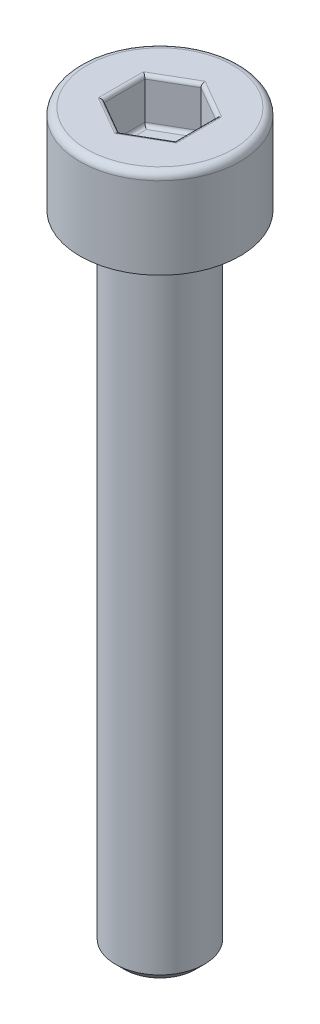
ISO-10303-21;
HEADER;
FILE_DESCRIPTION(('STEP AP214'),'2;1');
FILE_NAME('part.step','',(''),(''),'','','');
FILE_SCHEMA(('AUTOMOTIVE_DESIGN { 1 0 10303 214 1 1 1 1 }'));
ENDSEC;
DATA;
#1=APPLICATION_CONTEXT('core data for automotive mechanical design processes');
#2=APPLICATION_PROTOCOL_DEFINITION('international standard','automotive_design',2000,#1);
#3=PRODUCT_CONTEXT('',#1,'mechanical');
#4=PRODUCT('Part','Part','',(#3));
#5=PRODUCT_RELATED_PRODUCT_CATEGORY('part','',(#4));
#6=PRODUCT_DEFINITION_FORMATION('','',#4);
#7=PRODUCT_DEFINITION_CONTEXT('part definition',#1,'design');
#8=PRODUCT_DEFINITION('design','',#6,#7);
#9=PRODUCT_DEFINITION_SHAPE('','',#8);
#10=(LENGTH_UNIT() NAMED_UNIT(*) SI_UNIT(.MILLI.,.METRE.));
#11=(NAMED_UNIT(*) PLANE_ANGLE_UNIT() SI_UNIT($,.RADIAN.));
#12=(NAMED_UNIT(*) SI_UNIT($,.STERADIAN.) SOLID_ANGLE_UNIT());
#13=UNCERTAINTY_MEASURE_WITH_UNIT(LENGTH_MEASURE(1.E-05),#10,'distance_accuracy_value','');
#14=(GEOMETRIC_REPRESENTATION_CONTEXT(3) GLOBAL_UNCERTAINTY_ASSIGNED_CONTEXT((#13)) GLOBAL_UNIT_ASSIGNED_CONTEXT((#10,
#11,#12)) REPRESENTATION_CONTEXT('',''));
#15=CARTESIAN_POINT('',(0.,0.,0.));
#16=DIRECTION('',(0.,0.,1.));
#17=DIRECTION('',(1.,0.,0.));
#18=AXIS2_PLACEMENT_3D('',#15,#16,#17);
#19=CARTESIAN_POINT('',(0.,-20.5,0.));
#20=DIRECTION('',(0.,-1.,0.));
#21=DIRECTION('',(0.,0.,-1.));
#22=AXIS2_PLACEMENT_3D('',#19,#20,#21);
#23=PLANE('',#22);
#24=CARTESIAN_POINT('',(0.,-20.5,0.));
#25=DIRECTION('',(0.,-1.,0.));
#26=DIRECTION('',(0.,0.,-1.));
#27=AXIS2_PLACEMENT_3D('',#24,#25,#26);
#28=CIRCLE('',#27,0.999999999999997);
#29=CARTESIAN_POINT('',(0.,-20.5,-0.999999999999997));
#30=VERTEX_POINT('',#29);
#31=EDGE_CURVE('E265',#30,#30,#28,.T.);
#32=ORIENTED_EDGE('',*,*,#31,.T.);
#33=EDGE_LOOP('',(#32));
#34=FACE_BOUND('',#33,.T.);
#35=ADVANCED_FACE('F37',(#34),#23,.T.);
#36=CARTESIAN_POINT('',(0.,0.,0.));
#37=DIRECTION('',(0.,1.,0.));
#38=DIRECTION('',(0.,0.,1.));
#39=AXIS2_PLACEMENT_3D('',#36,#37,#38);
#40=CYLINDRICAL_SURFACE('',#39,1.25);
#41=CARTESIAN_POINT('',(0.,-2.74999999999999,0.));
#42=DIRECTION('',(0.,-1.,0.));
#43=DIRECTION('',(0.,0.,-1.));
#44=AXIS2_PLACEMENT_3D('',#41,#42,#43);
#45=CIRCLE('',#44,1.25);
#46=CARTESIAN_POINT('',(0.,-2.74999999999999,-1.25));
#47=VERTEX_POINT('',#46);
#48=EDGE_CURVE('E262',#47,#47,#45,.T.);
#49=ORIENTED_EDGE('',*,*,#48,.T.);
#50=EDGE_LOOP('',(#49));
#51=FACE_BOUND('',#50,.T.);
#52=CARTESIAN_POINT('',(0.,-20.25,0.));
#53=DIRECTION('',(0.,-1.,0.));
#54=DIRECTION('',(0.,0.,-1.));
#55=AXIS2_PLACEMENT_3D('',#52,#53,#54);
#56=CIRCLE('',#55,1.25);
#57=CARTESIAN_POINT('',(0.,-20.25,-1.25));
#58=VERTEX_POINT('',#57);
#59=EDGE_CURVE('E259',#58,#58,#56,.F.);
#60=ORIENTED_EDGE('',*,*,#59,.T.);
#61=EDGE_LOOP('',(#60));
#62=FACE_BOUND('',#61,.T.);
#63=ADVANCED_FACE('F291',(#51,#62),#40,.T.);
#64=CARTESIAN_POINT('',(-1.25,-2.5,0.));
#65=DIRECTION('',(0.,-1.,0.));
#66=DIRECTION('',(0.,0.,-1.));
#67=AXIS2_PLACEMENT_3D('',#64,#65,#66);
#68=PLANE('',#67);
#69=CARTESIAN_POINT('',(0.,-2.5,0.));
#70=DIRECTION('',(0.,-1.,0.));
#71=DIRECTION('',(0.,0.,-1.));
#72=AXIS2_PLACEMENT_3D('',#69,#70,#71);
#73=CIRCLE('',#72,1.5);
#74=CARTESIAN_POINT('',(0.,-2.5,-1.5));
#75=VERTEX_POINT('',#74);
#76=EDGE_CURVE('E256',#75,#75,#73,.F.);
#77=ORIENTED_EDGE('',*,*,#76,.T.);
#78=EDGE_LOOP('',(#77));
#79=FACE_BOUND('',#78,.T.);
#80=CARTESIAN_POINT('',(0.,-2.5,0.));
#81=DIRECTION('',(0.,1.,0.));
#82=DIRECTION('',(0.,0.,1.));
#83=AXIS2_PLACEMENT_3D('',#80,#81,#82);
#84=CIRCLE('',#83,2.25);
#85=CARTESIAN_POINT('',(0.,-2.5,2.25));
#86=VERTEX_POINT('',#85);
#87=EDGE_CURVE('E253',#86,#86,#84,.T.);
#88=ORIENTED_EDGE('',*,*,#87,.F.);
#89=EDGE_LOOP('',(#88));
#90=FACE_BOUND('',#89,.T.);
#91=ADVANCED_FACE('F297',(#79,#90),#68,.T.);
#92=CARTESIAN_POINT('',(0.,0.,0.));
#93=DIRECTION('',(0.,1.,0.));
#94=DIRECTION('',(0.,0.,1.));
#95=AXIS2_PLACEMENT_3D('',#92,#93,#94);
#96=CYLINDRICAL_SURFACE('',#95,2.25);
#97=CARTESIAN_POINT('',(0.,-0.2,0.));
#98=DIRECTION('',(0.,1.,0.));
#99=DIRECTION('',(0.,0.,1.));
#100=AXIS2_PLACEMENT_3D('',#97,#98,#99);
#101=CIRCLE('',#100,2.25);
#102=CARTESIAN_POINT('',(0.,-0.2,2.25));
#103=VERTEX_POINT('',#102);
#104=EDGE_CURVE('E163',#103,#103,#101,.F.);
#105=ORIENTED_EDGE('',*,*,#104,.T.);
#106=EDGE_LOOP('',(#105));
#107=FACE_BOUND('',#106,.T.);
#108=ORIENTED_EDGE('',*,*,#87,.T.);
#109=EDGE_LOOP('',(#108));
#110=FACE_BOUND('',#109,.T.);
#111=ADVANCED_FACE('F307',(#107,#110),#96,.T.);
#112=CARTESIAN_POINT('',(-2.25,0.,0.));
#113=DIRECTION('',(0.,1.,0.));
#114=DIRECTION('',(0.,0.,1.));
#115=AXIS2_PLACEMENT_3D('',#112,#113,#114);
#116=PLANE('',#115);
#117=DIRECTION('',(0.,0.,1.));
#118=VECTOR('',#117,1.);
#119=CARTESIAN_POINT('',(-1.1,0.,-0.577350269189627));
#120=LINE('',#119,#118);
#121=CARTESIAN_POINT('',(-1.1,0.,0.635085296108588));
#122=VERTEX_POINT('',#121);
#123=CARTESIAN_POINT('',(-1.1,0.,-0.635085296108589));
#124=VERTEX_POINT('',#123);
#125=EDGE_CURVE('E179',#122,#124,#120,.F.);
#126=ORIENTED_EDGE('',*,*,#125,.T.);
#127=DIRECTION('',(-0.866025403784439,0.,0.5));
#128=VECTOR('',#127,1.);
#129=CARTESIAN_POINT('',(-0.0500000000000009,0.,-1.2413030787577));
#130=LINE('',#129,#128);
#131=CARTESIAN_POINT('',(0.,0.,-1.27017059221718));
#132=VERTEX_POINT('',#131);
#133=EDGE_CURVE('E138',#124,#132,#130,.F.);
#134=ORIENTED_EDGE('',*,*,#133,.T.);
#135=DIRECTION('',(-0.866025403784439,0.,-0.5));
#136=VECTOR('',#135,1.);
#137=CARTESIAN_POINT('',(1.05,0.,-0.663952809568071));
#138=LINE('',#137,#136);
#139=CARTESIAN_POINT('',(1.1,0.,-0.63508529610859));
#140=VERTEX_POINT('',#139);
#141=EDGE_CURVE('E165',#132,#140,#138,.F.);
#142=ORIENTED_EDGE('',*,*,#141,.T.);
#143=DIRECTION('',(0.,0.,-1.));
#144=VECTOR('',#143,1.);
#145=CARTESIAN_POINT('',(1.1,0.,0.577350269189625));
#146=LINE('',#145,#144);
#147=CARTESIAN_POINT('',(1.1,0.,0.635085296108588));
#148=VERTEX_POINT('',#147);
#149=EDGE_CURVE('E173',#140,#148,#146,.F.);
#150=ORIENTED_EDGE('',*,*,#149,.T.);
#151=DIRECTION('',(0.866025403784439,0.,-0.5));
#152=VECTOR('',#151,1.);
#153=CARTESIAN_POINT('',(0.0499999999999991,0.,1.24130307875769));
#154=LINE('',#153,#152);
#155=CARTESIAN_POINT('',(0.,0.,1.27017059221718));
#156=VERTEX_POINT('',#155);
#157=EDGE_CURVE('E175',#148,#156,#154,.F.);
#158=ORIENTED_EDGE('',*,*,#157,.T.);
#159=DIRECTION('',(0.866025403784439,0.,0.5));
#160=VECTOR('',#159,1.);
#161=CARTESIAN_POINT('',(-1.05,0.,0.663952809568069));
#162=LINE('',#161,#160);
#163=EDGE_CURVE('E177',#156,#122,#162,.F.);
#164=ORIENTED_EDGE('',*,*,#163,.T.);
#165=EDGE_LOOP('',(#126,#134,#142,#150,#158,#164));
#166=FACE_BOUND('',#165,.T.);
#167=CARTESIAN_POINT('',(0.,0.,0.));
#168=DIRECTION('',(0.,1.,0.));
#169=DIRECTION('',(0.,0.,1.));
#170=AXIS2_PLACEMENT_3D('',#167,#168,#169);
#171=CIRCLE('',#170,2.05);
#172=CARTESIAN_POINT('',(0.,0.,2.05));
#173=VERTEX_POINT('',#172);
#174=EDGE_CURVE('E168',#173,#173,#171,.T.);
#175=ORIENTED_EDGE('',*,*,#174,.T.);
#176=EDGE_LOOP('',(#175));
#177=FACE_BOUND('',#176,.T.);
#178=ADVANCED_FACE('F270',(#166,#177),#116,.T.);
#179=CARTESIAN_POINT('',(0.,-2.5,0.));
#180=DIRECTION('',(0.,1.,0.));
#181=DIRECTION('',(0.,0.,1.));
#182=AXIS2_PLACEMENT_3D('',#179,#180,#181);
#183=CONICAL_SURFACE('',#182,1.5,0.785398163397457);
#184=ORIENTED_EDGE('',*,*,#48,.F.);
#185=EDGE_LOOP('',(#184));
#186=FACE_BOUND('',#185,.T.);
#187=ORIENTED_EDGE('',*,*,#76,.F.);
#188=EDGE_LOOP('',(#187));
#189=FACE_BOUND('',#188,.T.);
#190=ADVANCED_FACE('F285',(#186,#189),#183,.T.);
#191=CARTESIAN_POINT('',(0.,-20.25,0.));
#192=DIRECTION('',(0.,1.,0.));
#193=DIRECTION('',(0.,0.,1.));
#194=AXIS2_PLACEMENT_3D('',#191,#192,#193);
#195=CONICAL_SURFACE('',#194,1.25,0.785398163397447);
#196=ORIENTED_EDGE('',*,*,#31,.F.);
#197=EDGE_LOOP('',(#196));
#198=FACE_BOUND('',#197,.T.);
#199=ORIENTED_EDGE('',*,*,#59,.F.);
#200=EDGE_LOOP('',(#199));
#201=FACE_BOUND('',#200,.T.);
#202=ADVANCED_FACE('F275',(#198,#201),#195,.T.);
#203=CARTESIAN_POINT('',(0.,-0.2,0.));
#204=DIRECTION('',(0.,1.,0.));
#205=DIRECTION('',(0.,0.,1.));
#206=AXIS2_PLACEMENT_3D('',#203,#204,#205);
#207=TOROIDAL_SURFACE('',#206,2.05,0.2);
#208=ORIENTED_EDGE('',*,*,#104,.F.);
#209=EDGE_LOOP('',(#208));
#210=FACE_BOUND('',#209,.T.);
#211=ORIENTED_EDGE('',*,*,#174,.F.);
#212=EDGE_LOOP('',(#211));
#213=FACE_BOUND('',#212,.T.);
#214=ADVANCED_FACE('F272',(#210,#213),#207,.T.);
#215=CARTESIAN_POINT('',(0.999999999999998,-1.25,-0.577350269189627));
#216=DIRECTION('',(0.5,0.,-0.866025403784439));
#217=DIRECTION('',(-0.866025403784439,0.,-0.5));
#218=AXIS2_PLACEMENT_3D('',#215,#216,#217);
#219=PLANE('',#218);
#220=DIRECTION('',(0.,1.,0.));
#221=VECTOR('',#220,1.);
#222=CARTESIAN_POINT('',(0.999999999999998,-1.25,-0.577350269189627));
#223=LINE('',#222,#221);
#224=CARTESIAN_POINT('',(0.999999999999998,-1.15,-0.577350269189627));
#225=VERTEX_POINT('',#224);
#226=CARTESIAN_POINT('',(0.999999999999998,-0.1,-0.577350269189627));
#227=VERTEX_POINT('',#226);
#228=EDGE_CURVE('E247',#225,#227,#223,.T.);
#229=ORIENTED_EDGE('',*,*,#228,.T.);
#230=DIRECTION('',(-0.866025403784439,0.,-0.5));
#231=VECTOR('',#230,1.);
#232=CARTESIAN_POINT('',(0.,-0.1,-1.15470053837925));
#233=LINE('',#232,#231);
#234=CARTESIAN_POINT('',(0.,-0.1,-1.15470053837925));
#235=VERTEX_POINT('',#234);
#236=EDGE_CURVE('E199',#227,#235,#233,.T.);
#237=ORIENTED_EDGE('',*,*,#236,.T.);
#238=DIRECTION('',(0.,1.,0.));
#239=VECTOR('',#238,1.);
#240=CARTESIAN_POINT('',(0.,-1.25,-1.15470053837925));
#241=LINE('',#240,#239);
#242=CARTESIAN_POINT('',(0.,-1.15,-1.15470053837925));
#243=VERTEX_POINT('',#242);
#244=EDGE_CURVE('E149',#243,#235,#241,.T.);
#245=ORIENTED_EDGE('',*,*,#244,.F.);
#246=DIRECTION('',(-0.866025403784439,0.,-0.5));
#247=VECTOR('',#246,1.);
#248=CARTESIAN_POINT('',(0.999999999999998,-1.15,-0.577350269189627));
#249=LINE('',#248,#247);
#250=EDGE_CURVE('E197',#243,#225,#249,.F.);
#251=ORIENTED_EDGE('',*,*,#250,.T.);
#252=EDGE_LOOP('',(#229,#237,#245,#251));
#253=FACE_BOUND('',#252,.T.);
#254=ADVANCED_FACE('F274',(#253),#219,.F.);
#255=CARTESIAN_POINT('',(0.999999999999999,-1.25,0.577350269189625));
#256=DIRECTION('',(1.,0.,0.));
#257=DIRECTION('',(0.,0.,-1.));
#258=AXIS2_PLACEMENT_3D('',#255,#256,#257);
#259=PLANE('',#258);
#260=DIRECTION('',(0.,1.,0.));
#261=VECTOR('',#260,1.);
#262=CARTESIAN_POINT('',(0.999999999999999,-1.25,0.577350269189625));
#263=LINE('',#262,#261);
#264=CARTESIAN_POINT('',(0.999999999999999,-1.15,0.577350269189625));
#265=VERTEX_POINT('',#264);
#266=CARTESIAN_POINT('',(0.999999999999999,-0.1,0.577350269189625));
#267=VERTEX_POINT('',#266);
#268=EDGE_CURVE('E244',#265,#267,#263,.T.);
#269=ORIENTED_EDGE('',*,*,#268,.T.);
#270=DIRECTION('',(0.,0.,-1.));
#271=VECTOR('',#270,1.);
#272=CARTESIAN_POINT('',(0.999999999999998,-0.1,-0.577350269189627));
#273=LINE('',#272,#271);
#274=EDGE_CURVE('E195',#267,#227,#273,.T.);
#275=ORIENTED_EDGE('',*,*,#274,.T.);
#276=ORIENTED_EDGE('',*,*,#228,.F.);
#277=DIRECTION('',(0.,0.,-1.));
#278=VECTOR('',#277,1.);
#279=CARTESIAN_POINT('',(0.999999999999999,-1.15,0.577350269189625));
#280=LINE('',#279,#278);
#281=EDGE_CURVE('E192',#225,#265,#280,.F.);
#282=ORIENTED_EDGE('',*,*,#281,.T.);
#283=EDGE_LOOP('',(#269,#275,#276,#282));
#284=FACE_BOUND('',#283,.T.);
#285=ADVANCED_FACE('F282',(#284),#259,.F.);
#286=CARTESIAN_POINT('',(0.,-1.25,1.15470053837925));
#287=DIRECTION('',(0.5,0.,0.866025403784439));
#288=DIRECTION('',(0.866025403784439,0.,-0.5));
#289=AXIS2_PLACEMENT_3D('',#286,#287,#288);
#290=PLANE('',#289);
#291=DIRECTION('',(0.,1.,0.));
#292=VECTOR('',#291,1.);
#293=CARTESIAN_POINT('',(0.,-1.25,1.15470053837925));
#294=LINE('',#293,#292);
#295=CARTESIAN_POINT('',(0.,-1.15,1.15470053837925));
#296=VERTEX_POINT('',#295);
#297=CARTESIAN_POINT('',(0.,-0.1,1.15470053837925));
#298=VERTEX_POINT('',#297);
#299=EDGE_CURVE('E241',#296,#298,#294,.T.);
#300=ORIENTED_EDGE('',*,*,#299,.T.);
#301=DIRECTION('',(0.866025403784439,0.,-0.5));
#302=VECTOR('',#301,1.);
#303=CARTESIAN_POINT('',(0.999999999999999,-0.1,0.577350269189625));
#304=LINE('',#303,#302);
#305=EDGE_CURVE('E190',#298,#267,#304,.T.);
#306=ORIENTED_EDGE('',*,*,#305,.T.);
#307=ORIENTED_EDGE('',*,*,#268,.F.);
#308=DIRECTION('',(0.866025403784439,0.,-0.5));
#309=VECTOR('',#308,1.);
#310=CARTESIAN_POINT('',(0.,-1.15,1.15470053837925));
#311=LINE('',#310,#309);
#312=EDGE_CURVE('E188',#265,#296,#311,.F.);
#313=ORIENTED_EDGE('',*,*,#312,.T.);
#314=EDGE_LOOP('',(#300,#306,#307,#313));
#315=FACE_BOUND('',#314,.T.);
#316=ADVANCED_FACE('F331',(#315),#290,.F.);
#317=CARTESIAN_POINT('',(-1.,-1.25,0.577350269189625));
#318=DIRECTION('',(-0.5,0.,0.866025403784438));
#319=DIRECTION('',(0.866025403784439,0.,0.5));
#320=AXIS2_PLACEMENT_3D('',#317,#318,#319);
#321=PLANE('',#320);
#322=DIRECTION('',(0.,1.,0.));
#323=VECTOR('',#322,1.);
#324=CARTESIAN_POINT('',(-1.,-1.25,0.577350269189625));
#325=LINE('',#324,#323);
#326=CARTESIAN_POINT('',(-1.,-1.15,0.577350269189625));
#327=VERTEX_POINT('',#326);
#328=CARTESIAN_POINT('',(-1.,-0.1,0.577350269189625));
#329=VERTEX_POINT('',#328);
#330=EDGE_CURVE('E132',#327,#329,#325,.T.);
#331=ORIENTED_EDGE('',*,*,#330,.T.);
#332=DIRECTION('',(0.866025403784439,0.,0.5));
#333=VECTOR('',#332,1.);
#334=CARTESIAN_POINT('',(0.,-0.1,1.15470053837925));
#335=LINE('',#334,#333);
#336=EDGE_CURVE('E186',#329,#298,#335,.T.);
#337=ORIENTED_EDGE('',*,*,#336,.T.);
#338=ORIENTED_EDGE('',*,*,#299,.F.);
#339=DIRECTION('',(0.866025403784439,0.,0.5));
#340=VECTOR('',#339,1.);
#341=CARTESIAN_POINT('',(-1.,-1.15,0.577350269189625));
#342=LINE('',#341,#340);
#343=EDGE_CURVE('E184',#296,#327,#342,.F.);
#344=ORIENTED_EDGE('',*,*,#343,.T.);
#345=EDGE_LOOP('',(#331,#337,#338,#344));
#346=FACE_BOUND('',#345,.T.);
#347=ADVANCED_FACE('F238',(#346),#321,.F.);
#348=CARTESIAN_POINT('',(-1.,-1.25,-0.577350269189627));
#349=DIRECTION('',(-1.,0.,0.));
#350=DIRECTION('',(0.,0.,1.));
#351=AXIS2_PLACEMENT_3D('',#348,#349,#350);
#352=PLANE('',#351);
#353=DIRECTION('',(0.,1.,0.));
#354=VECTOR('',#353,1.);
#355=CARTESIAN_POINT('',(-1.,-1.25,-0.577350269189627));
#356=LINE('',#355,#354);
#357=CARTESIAN_POINT('',(-1.,-1.15,-0.577350269189627));
#358=VERTEX_POINT('',#357);
#359=CARTESIAN_POINT('',(-1.,-0.1,-0.577350269189627));
#360=VERTEX_POINT('',#359);
#361=EDGE_CURVE('E130',#358,#360,#356,.T.);
#362=ORIENTED_EDGE('',*,*,#361,.T.);
#363=DIRECTION('',(0.,0.,1.));
#364=VECTOR('',#363,1.);
#365=CARTESIAN_POINT('',(-1.,-0.1,0.577350269189625));
#366=LINE('',#365,#364);
#367=EDGE_CURVE('E137',#360,#329,#366,.T.);
#368=ORIENTED_EDGE('',*,*,#367,.T.);
#369=ORIENTED_EDGE('',*,*,#330,.F.);
#370=DIRECTION('',(0.,0.,1.));
#371=VECTOR('',#370,1.);
#372=CARTESIAN_POINT('',(-1.,-1.15,-0.577350269189627));
#373=LINE('',#372,#371);
#374=EDGE_CURVE('E127',#327,#358,#373,.F.);
#375=ORIENTED_EDGE('',*,*,#374,.T.);
#376=EDGE_LOOP('',(#362,#368,#369,#375));
#377=FACE_BOUND('',#376,.T.);
#378=ADVANCED_FACE('F129',(#377),#352,.F.);
#379=CARTESIAN_POINT('',(0.,-1.25,-1.15470053837925));
#380=DIRECTION('',(-0.5,0.,-0.866025403784438));
#381=DIRECTION('',(-0.866025403784439,0.,0.5));
#382=AXIS2_PLACEMENT_3D('',#379,#380,#381);
#383=PLANE('',#382);
#384=ORIENTED_EDGE('',*,*,#244,.T.);
#385=DIRECTION('',(-0.866025403784439,0.,0.5));
#386=VECTOR('',#385,1.);
#387=CARTESIAN_POINT('',(-1.,-0.1,-0.577350269189626));
#388=LINE('',#387,#386);
#389=EDGE_CURVE('E148',#235,#360,#388,.T.);
#390=ORIENTED_EDGE('',*,*,#389,.T.);
#391=ORIENTED_EDGE('',*,*,#361,.F.);
#392=DIRECTION('',(-0.866025403784439,0.,0.5));
#393=VECTOR('',#392,1.);
#394=CARTESIAN_POINT('',(0.,-1.15,-1.15470053837925));
#395=LINE('',#394,#393);
#396=EDGE_CURVE('E145',#358,#243,#395,.F.);
#397=ORIENTED_EDGE('',*,*,#396,.T.);
#398=EDGE_LOOP('',(#384,#390,#391,#397));
#399=FACE_BOUND('',#398,.T.);
#400=ADVANCED_FACE('F143',(#399),#383,.F.);
#401=CARTESIAN_POINT('',(0.,-1.25,-1.15470053837925));
#402=DIRECTION('',(0.,1.,0.));
#403=DIRECTION('',(0.,0.,1.));
#404=AXIS2_PLACEMENT_3D('',#401,#402,#403);
#405=PLANE('',#404);
#406=DIRECTION('',(0.866025403784439,0.,-0.5));
#407=VECTOR('',#406,1.);
#408=CARTESIAN_POINT('',(0.949999999999999,-1.25,0.490747728811181));
#409=LINE('',#408,#407);
#410=CARTESIAN_POINT('',(0.,-1.25,1.03923048454133));
#411=VERTEX_POINT('',#410);
#412=CARTESIAN_POINT('',(0.899999999999999,-1.25,0.519615242270663));
#413=VERTEX_POINT('',#412);
#414=EDGE_CURVE('E46',#411,#413,#409,.T.);
#415=ORIENTED_EDGE('',*,*,#414,.T.);
#416=DIRECTION('',(0.,0.,-1.));
#417=VECTOR('',#416,1.);
#418=CARTESIAN_POINT('',(0.899999999999998,-1.25,-1.15470053837925));
#419=LINE('',#418,#417);
#420=CARTESIAN_POINT('',(0.899999999999998,-1.25,-0.519615242270664));
#421=VERTEX_POINT('',#420);
#422=EDGE_CURVE('E11',#413,#421,#419,.T.);
#423=ORIENTED_EDGE('',*,*,#422,.T.);
#424=DIRECTION('',(-0.866025403784439,0.,-0.5));
#425=VECTOR('',#424,1.);
#426=CARTESIAN_POINT('',(-0.0500000000000008,-1.25,-1.06809799800081));
#427=LINE('',#426,#425);
#428=CARTESIAN_POINT('',(0.,-1.25,-1.03923048454133));
#429=VERTEX_POINT('',#428);
#430=EDGE_CURVE('E201',#421,#429,#427,.T.);
#431=ORIENTED_EDGE('',*,*,#430,.T.);
#432=DIRECTION('',(-0.866025403784439,0.,0.5));
#433=VECTOR('',#432,1.);
#434=CARTESIAN_POINT('',(0.0499999999999993,-1.25,-1.06809799800081));
#435=LINE('',#434,#433);
#436=CARTESIAN_POINT('',(-0.9,-1.25,-0.519615242270664));
#437=VERTEX_POINT('',#436);
#438=EDGE_CURVE('E203',#429,#437,#435,.T.);
#439=ORIENTED_EDGE('',*,*,#438,.T.);
#440=DIRECTION('',(0.,0.,1.));
#441=VECTOR('',#440,1.);
#442=CARTESIAN_POINT('',(-0.9,-1.25,-1.15470053837925));
#443=LINE('',#442,#441);
#444=CARTESIAN_POINT('',(-0.9,-1.25,0.519615242270662));
#445=VERTEX_POINT('',#444);
#446=EDGE_CURVE('E154',#437,#445,#443,.T.);
#447=ORIENTED_EDGE('',*,*,#446,.T.);
#448=DIRECTION('',(0.866025403784439,0.,0.5));
#449=VECTOR('',#448,1.);
#450=CARTESIAN_POINT('',(-0.950000000000001,-1.25,0.490747728811181));
#451=LINE('',#450,#449);
#452=EDGE_CURVE('E57',#445,#411,#451,.T.);
#453=ORIENTED_EDGE('',*,*,#452,.T.);
#454=EDGE_LOOP('',(#415,#423,#431,#439,#447,#453));
#455=FACE_BOUND('',#454,.T.);
#456=ADVANCED_FACE('F326',(#455),#405,.T.);
#457=CARTESIAN_POINT('',(0.0499999999999991,-0.1,1.24130307875769));
#458=DIRECTION('',(-0.866025403784439,0.,0.5));
#459=DIRECTION('',(0.5,0.,0.866025403784439));
#460=AXIS2_PLACEMENT_3D('',#457,#458,#459);
#461=CYLINDRICAL_SURFACE('',#460,0.1);
#462=CARTESIAN_POINT('',(0.,-0.1,1.27017059221718));
#463=DIRECTION('',(-1.,0.,0.));
#464=DIRECTION('',(0.,0.,-1.));
#465=AXIS2_PLACEMENT_3D('',#462,#463,#464);
#466=ELLIPSE('',#465,0.115470053837925,0.1);
#467=EDGE_CURVE('E218',#156,#298,#466,.T.);
#468=ORIENTED_EDGE('',*,*,#467,.F.);
#469=ORIENTED_EDGE('',*,*,#157,.F.);
#470=CARTESIAN_POINT('',(1.1,-0.1,0.635085296108588));
#471=DIRECTION('',(-0.5,0.,0.866025403784439));
#472=DIRECTION('',(-0.866025403784439,0.,-0.5));
#473=AXIS2_PLACEMENT_3D('',#470,#471,#472);
#474=ELLIPSE('',#473,0.115470053837925,0.1);
#475=EDGE_CURVE('E221',#267,#148,#474,.F.);
#476=ORIENTED_EDGE('',*,*,#475,.F.);
#477=ORIENTED_EDGE('',*,*,#305,.F.);
#478=EDGE_LOOP('',(#468,#469,#476,#477));
#479=FACE_BOUND('',#478,.T.);
#480=ADVANCED_FACE('F338',(#479),#461,.T.);
#481=CARTESIAN_POINT('',(1.1,-0.1,0.577350269189625));
#482=DIRECTION('',(0.,0.,1.));
#483=DIRECTION('',(1.,0.,0.));
#484=AXIS2_PLACEMENT_3D('',#481,#482,#483);
#485=CYLINDRICAL_SURFACE('',#484,0.1);
#486=ORIENTED_EDGE('',*,*,#475,.T.);
#487=ORIENTED_EDGE('',*,*,#149,.F.);
#488=CARTESIAN_POINT('',(1.1,-0.1,-0.63508529610859));
#489=DIRECTION('',(0.5,0.,0.866025403784439));
#490=DIRECTION('',(-0.866025403784439,0.,0.5));
#491=AXIS2_PLACEMENT_3D('',#488,#489,#490);
#492=ELLIPSE('',#491,0.115470053837925,0.1);
#493=EDGE_CURVE('E215',#227,#140,#492,.F.);
#494=ORIENTED_EDGE('',*,*,#493,.F.);
#495=ORIENTED_EDGE('',*,*,#274,.F.);
#496=EDGE_LOOP('',(#486,#487,#494,#495));
#497=FACE_BOUND('',#496,.T.);
#498=ADVANCED_FACE('F342',(#497),#485,.T.);
#499=CARTESIAN_POINT('',(-1.05,-0.1,0.663952809568069));
#500=DIRECTION('',(-0.866025403784439,0.,-0.5));
#501=DIRECTION('',(-0.5,0.,0.866025403784438));
#502=AXIS2_PLACEMENT_3D('',#499,#500,#501);
#503=CYLINDRICAL_SURFACE('',#502,0.1);
#504=ORIENTED_EDGE('',*,*,#467,.T.);
#505=ORIENTED_EDGE('',*,*,#336,.F.);
#506=CARTESIAN_POINT('',(-1.1,-0.1,0.635085296108587));
#507=DIRECTION('',(-0.5,0.,-0.866025403784439));
#508=DIRECTION('',(0.866025403784439,0.,-0.5));
#509=AXIS2_PLACEMENT_3D('',#506,#507,#508);
#510=ELLIPSE('',#509,0.115470053837925,0.1);
#511=EDGE_CURVE('E212',#122,#329,#510,.T.);
#512=ORIENTED_EDGE('',*,*,#511,.F.);
#513=ORIENTED_EDGE('',*,*,#163,.F.);
#514=EDGE_LOOP('',(#504,#505,#512,#513));
#515=FACE_BOUND('',#514,.T.);
#516=ADVANCED_FACE('F348',(#515),#503,.T.);
#517=CARTESIAN_POINT('',(1.05,-0.1,-0.663952809568071));
#518=DIRECTION('',(0.866025403784439,0.,0.5));
#519=DIRECTION('',(0.5,0.,-0.866025403784439));
#520=AXIS2_PLACEMENT_3D('',#517,#518,#519);
#521=CYLINDRICAL_SURFACE('',#520,0.1);
#522=ORIENTED_EDGE('',*,*,#493,.T.);
#523=ORIENTED_EDGE('',*,*,#141,.F.);
#524=CARTESIAN_POINT('',(0.,-0.1,-1.27017059221718));
#525=DIRECTION('',(1.,0.,0.));
#526=DIRECTION('',(0.,0.,-1.));
#527=AXIS2_PLACEMENT_3D('',#524,#525,#526);
#528=ELLIPSE('',#527,0.115470053837925,0.1);
#529=EDGE_CURVE('E210',#235,#132,#528,.F.);
#530=ORIENTED_EDGE('',*,*,#529,.F.);
#531=ORIENTED_EDGE('',*,*,#236,.F.);
#532=EDGE_LOOP('',(#522,#523,#530,#531));
#533=FACE_BOUND('',#532,.T.);
#534=ADVANCED_FACE('F378',(#533),#521,.T.);
#535=CARTESIAN_POINT('',(-1.1,-0.1,-0.577350269189627));
#536=DIRECTION('',(0.,0.,-1.));
#537=DIRECTION('',(-1.,0.,0.));
#538=AXIS2_PLACEMENT_3D('',#535,#536,#537);
#539=CYLINDRICAL_SURFACE('',#538,0.1);
#540=ORIENTED_EDGE('',*,*,#511,.T.);
#541=ORIENTED_EDGE('',*,*,#367,.F.);
#542=CARTESIAN_POINT('',(-1.1,-0.1,-0.635085296108589));
#543=DIRECTION('',(0.5,0.,-0.866025403784439));
#544=DIRECTION('',(0.866025403784439,0.,0.5));
#545=AXIS2_PLACEMENT_3D('',#542,#543,#544);
#546=ELLIPSE('',#545,0.115470053837925,0.1);
#547=EDGE_CURVE('E208',#124,#360,#546,.T.);
#548=ORIENTED_EDGE('',*,*,#547,.F.);
#549=ORIENTED_EDGE('',*,*,#125,.F.);
#550=EDGE_LOOP('',(#540,#541,#548,#549));
#551=FACE_BOUND('',#550,.T.);
#552=ADVANCED_FACE('F373',(#551),#539,.T.);
#553=CARTESIAN_POINT('',(-0.0500000000000009,-0.1,-1.2413030787577));
#554=DIRECTION('',(0.866025403784439,0.,-0.5));
#555=DIRECTION('',(-0.5,0.,-0.866025403784438));
#556=AXIS2_PLACEMENT_3D('',#553,#554,#555);
#557=CYLINDRICAL_SURFACE('',#556,0.1);
#558=ORIENTED_EDGE('',*,*,#529,.T.);
#559=ORIENTED_EDGE('',*,*,#133,.F.);
#560=ORIENTED_EDGE('',*,*,#547,.T.);
#561=ORIENTED_EDGE('',*,*,#389,.F.);
#562=EDGE_LOOP('',(#558,#559,#560,#561));
#563=FACE_BOUND('',#562,.T.);
#564=ADVANCED_FACE('F369',(#563),#557,.T.);
#565=CARTESIAN_POINT('',(-0.9,-1.15,-1.15470053837925));
#566=DIRECTION('',(0.,0.,1.));
#567=DIRECTION('',(1.,0.,0.));
#568=AXIS2_PLACEMENT_3D('',#565,#566,#567);
#569=CYLINDRICAL_SURFACE('',#568,0.1);
#570=CARTESIAN_POINT('',(-0.900000000000001,-1.15,-0.519615242270664));
#571=DIRECTION('',(-0.5,0.,0.866025403784439));
#572=DIRECTION('',(0.866025403784439,0.,0.5));
#573=AXIS2_PLACEMENT_3D('',#570,#571,#572);
#574=ELLIPSE('',#573,0.115470053837925,0.1);
#575=EDGE_CURVE('E153',#358,#437,#574,.T.);
#576=ORIENTED_EDGE('',*,*,#575,.F.);
#577=ORIENTED_EDGE('',*,*,#374,.F.);
#578=CARTESIAN_POINT('',(-0.9,-1.15,0.519615242270662));
#579=DIRECTION('',(0.5,0.,0.866025403784439));
#580=DIRECTION('',(0.866025403784439,0.,-0.5));
#581=AXIS2_PLACEMENT_3D('',#578,#579,#580);
#582=ELLIPSE('',#581,0.115470053837925,0.1);
#583=EDGE_CURVE('E41',#445,#327,#582,.F.);
#584=ORIENTED_EDGE('',*,*,#583,.F.);
#585=ORIENTED_EDGE('',*,*,#446,.F.);
#586=EDGE_LOOP('',(#576,#577,#584,#585));
#587=FACE_BOUND('',#586,.T.);
#588=ADVANCED_FACE('F39',(#587),#569,.F.);
#589=CARTESIAN_POINT('',(-0.950000000000001,-1.15,0.490747728811181));
#590=DIRECTION('',(0.866025403784439,0.,0.5));
#591=DIRECTION('',(0.5,0.,-0.866025403784438));
#592=AXIS2_PLACEMENT_3D('',#589,#590,#591);
#593=CYLINDRICAL_SURFACE('',#592,0.1);
#594=ORIENTED_EDGE('',*,*,#583,.T.);
#595=ORIENTED_EDGE('',*,*,#343,.F.);
#596=CARTESIAN_POINT('',(0.,-1.15,1.03923048454133));
#597=DIRECTION('',(1.,0.,0.));
#598=DIRECTION('',(0.,0.,-1.));
#599=AXIS2_PLACEMENT_3D('',#596,#597,#598);
#600=ELLIPSE('',#599,0.115470053837925,0.1);
#601=EDGE_CURVE('E157',#411,#296,#600,.F.);
#602=ORIENTED_EDGE('',*,*,#601,.F.);
#603=ORIENTED_EDGE('',*,*,#452,.F.);
#604=EDGE_LOOP('',(#594,#595,#602,#603));
#605=FACE_BOUND('',#604,.T.);
#606=ADVANCED_FACE('F235',(#605),#593,.F.);
#607=CARTESIAN_POINT('',(0.0499999999999993,-1.15,-1.06809799800081));
#608=DIRECTION('',(-0.866025403784439,0.,0.5));
#609=DIRECTION('',(0.5,0.,0.866025403784438));
#610=AXIS2_PLACEMENT_3D('',#607,#608,#609);
#611=CYLINDRICAL_SURFACE('',#610,0.1);
#612=ORIENTED_EDGE('',*,*,#575,.T.);
#613=ORIENTED_EDGE('',*,*,#438,.F.);
#614=CARTESIAN_POINT('',(0.,-1.15,-1.03923048454133));
#615=DIRECTION('',(-1.,0.,0.));
#616=DIRECTION('',(0.,0.,1.));
#617=AXIS2_PLACEMENT_3D('',#614,#615,#616);
#618=ELLIPSE('',#617,0.115470053837925,0.1);
#619=EDGE_CURVE('E161',#243,#429,#618,.T.);
#620=ORIENTED_EDGE('',*,*,#619,.F.);
#621=ORIENTED_EDGE('',*,*,#396,.F.);
#622=EDGE_LOOP('',(#612,#613,#620,#621));
#623=FACE_BOUND('',#622,.T.);
#624=ADVANCED_FACE('F159',(#623),#611,.F.);
#625=CARTESIAN_POINT('',(0.949999999999999,-1.15,0.490747728811181));
#626=DIRECTION('',(0.866025403784439,0.,-0.5));
#627=DIRECTION('',(-0.5,0.,-0.866025403784439));
#628=AXIS2_PLACEMENT_3D('',#625,#626,#627);
#629=CYLINDRICAL_SURFACE('',#628,0.1);
#630=ORIENTED_EDGE('',*,*,#601,.T.);
#631=ORIENTED_EDGE('',*,*,#312,.F.);
#632=CARTESIAN_POINT('',(0.899999999999999,-1.15,0.519615242270662));
#633=DIRECTION('',(0.5,0.,-0.866025403784439));
#634=DIRECTION('',(-0.866025403784439,0.,-0.5));
#635=AXIS2_PLACEMENT_3D('',#632,#633,#634);
#636=ELLIPSE('',#635,0.115470053837925,0.1);
#637=EDGE_CURVE('E226',#413,#265,#636,.F.);
#638=ORIENTED_EDGE('',*,*,#637,.F.);
#639=ORIENTED_EDGE('',*,*,#414,.F.);
#640=EDGE_LOOP('',(#630,#631,#638,#639));
#641=FACE_BOUND('',#640,.T.);
#642=ADVANCED_FACE('F232',(#641),#629,.F.);
#643=CARTESIAN_POINT('',(-0.0500000000000008,-1.15,-1.06809799800081));
#644=DIRECTION('',(-0.866025403784439,0.,-0.5));
#645=DIRECTION('',(-0.5,0.,0.866025403784439));
#646=AXIS2_PLACEMENT_3D('',#643,#644,#645);
#647=CYLINDRICAL_SURFACE('',#646,0.1);
#648=ORIENTED_EDGE('',*,*,#619,.T.);
#649=ORIENTED_EDGE('',*,*,#430,.F.);
#650=CARTESIAN_POINT('',(0.899999999999998,-1.15,-0.519615242270664));
#651=DIRECTION('',(-0.5,0.,-0.866025403784439));
#652=DIRECTION('',(0.866025403784439,0.,-0.5));
#653=AXIS2_PLACEMENT_3D('',#650,#651,#652);
#654=ELLIPSE('',#653,0.115470053837925,0.1);
#655=EDGE_CURVE('E224',#225,#421,#654,.T.);
#656=ORIENTED_EDGE('',*,*,#655,.F.);
#657=ORIENTED_EDGE('',*,*,#250,.F.);
#658=EDGE_LOOP('',(#648,#649,#656,#657));
#659=FACE_BOUND('',#658,.T.);
#660=ADVANCED_FACE('F357',(#659),#647,.F.);
#661=CARTESIAN_POINT('',(0.899999999999998,-1.15,-1.15470053837925));
#662=DIRECTION('',(0.,0.,-1.));
#663=DIRECTION('',(-1.,0.,0.));
#664=AXIS2_PLACEMENT_3D('',#661,#662,#663);
#665=CYLINDRICAL_SURFACE('',#664,0.1);
#666=ORIENTED_EDGE('',*,*,#637,.T.);
#667=ORIENTED_EDGE('',*,*,#281,.F.);
#668=ORIENTED_EDGE('',*,*,#655,.T.);
#669=ORIENTED_EDGE('',*,*,#422,.F.);
#670=EDGE_LOOP('',(#666,#667,#668,#669));
#671=FACE_BOUND('',#670,.T.);
#672=ADVANCED_FACE('F354',(#671),#665,.F.);
#673=CLOSED_SHELL('',(#35,#63,#91,#111,#178,#190,#202,#214,#254,#285,#316,#347,#378,#400,#456,
#480,#498,#516,#534,#552,#564,#588,#606,#624,#642,#660,#672));
#674=MANIFOLD_SOLID_BREP('B2',#673);
#675=ADVANCED_BREP_SHAPE_REPRESENTATION('',(#18,#674),#14);
#676=SHAPE_DEFINITION_REPRESENTATION(#9,#675);
ENDSEC;
END-ISO-10303-21;
